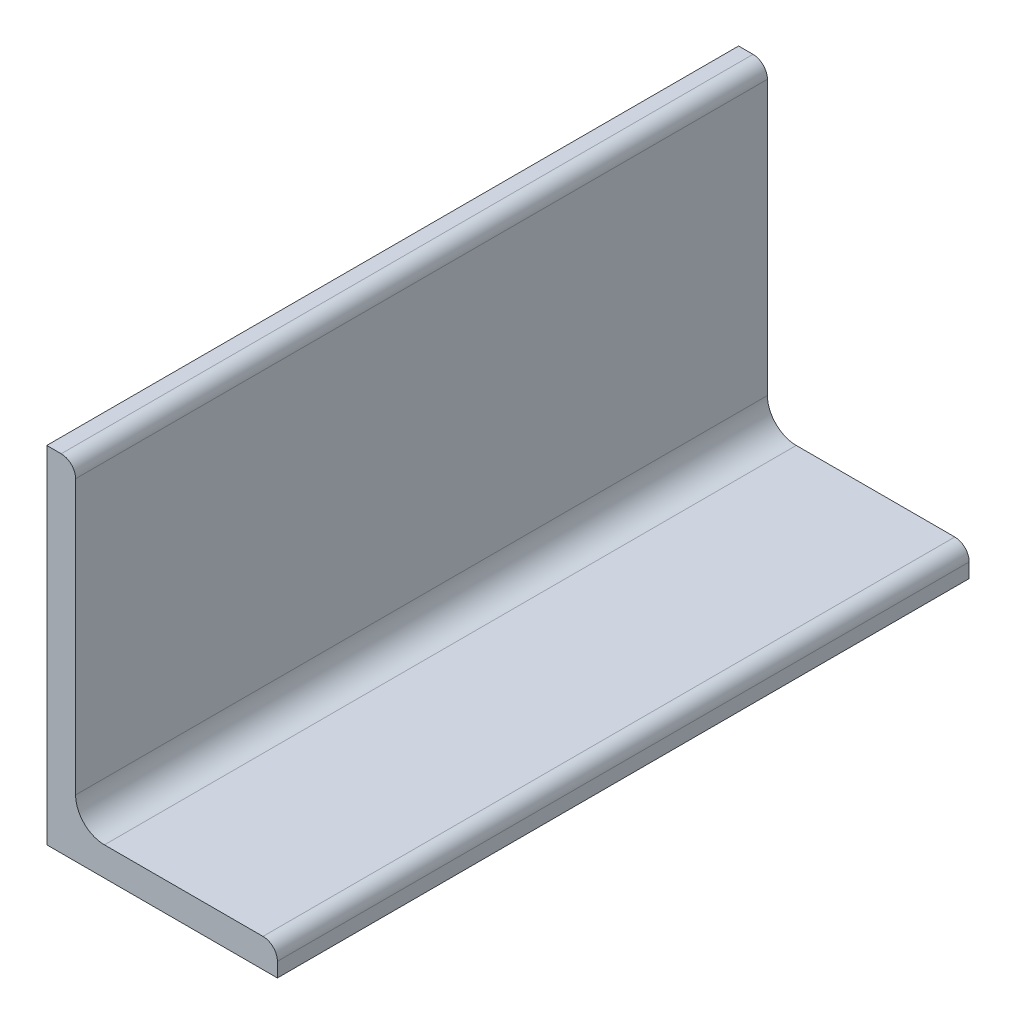
ISO-10303-21;
HEADER;
FILE_DESCRIPTION(('STEP AP214'),'2;1');
FILE_NAME('part.step','',(''),(''),'','','');
FILE_SCHEMA(('AUTOMOTIVE_DESIGN { 1 0 10303 214 1 1 1 1 }'));
ENDSEC;
DATA;
#1=APPLICATION_CONTEXT('core data for automotive mechanical design processes');
#2=APPLICATION_PROTOCOL_DEFINITION('international standard','automotive_design',2000,#1);
#3=PRODUCT_CONTEXT('',#1,'mechanical');
#4=PRODUCT('Part','Part','',(#3));
#5=PRODUCT_RELATED_PRODUCT_CATEGORY('part','',(#4));
#6=PRODUCT_DEFINITION_FORMATION('','',#4);
#7=PRODUCT_DEFINITION_CONTEXT('part definition',#1,'design');
#8=PRODUCT_DEFINITION('design','',#6,#7);
#9=PRODUCT_DEFINITION_SHAPE('','',#8);
#10=(LENGTH_UNIT() NAMED_UNIT(*) SI_UNIT(.MILLI.,.METRE.));
#11=(NAMED_UNIT(*) PLANE_ANGLE_UNIT() SI_UNIT($,.RADIAN.));
#12=(NAMED_UNIT(*) SI_UNIT($,.STERADIAN.) SOLID_ANGLE_UNIT());
#13=UNCERTAINTY_MEASURE_WITH_UNIT(LENGTH_MEASURE(1.E-05),#10,'distance_accuracy_value','');
#14=(GEOMETRIC_REPRESENTATION_CONTEXT(3) GLOBAL_UNCERTAINTY_ASSIGNED_CONTEXT((#13)) GLOBAL_UNIT_ASSIGNED_CONTEXT((#10,
#11,#12)) REPRESENTATION_CONTEXT('',''));
#15=CARTESIAN_POINT('',(0.,0.,0.));
#16=DIRECTION('',(0.,0.,1.));
#17=DIRECTION('',(1.,0.,0.));
#18=AXIS2_PLACEMENT_3D('',#15,#16,#17);
#19=CARTESIAN_POINT('',(0.865045893659089,152.925428131371,304.8));
#20=DIRECTION('',(1.,0.,0.));
#21=DIRECTION('',(0.,0.,-1.));
#22=AXIS2_PLACEMENT_3D('',#19,#20,#21);
#23=PLANE('',#22);
#24=DIRECTION('',(0.,-1.,0.));
#25=VECTOR('',#24,1.);
#26=CARTESIAN_POINT('',(0.865045893659089,152.925428131371,0.));
#27=LINE('',#26,#25);
#28=CARTESIAN_POINT('',(0.865045893659089,152.925428131371,0.));
#29=VERTEX_POINT('',#28);
#30=CARTESIAN_POINT('',(0.865045893659089,0.525428131371291,0.));
#31=VERTEX_POINT('',#30);
#32=EDGE_CURVE('E135',#29,#31,#27,.T.);
#33=ORIENTED_EDGE('',*,*,#32,.T.);
#34=DIRECTION('',(0.,0.,-1.));
#35=VECTOR('',#34,1.);
#36=CARTESIAN_POINT('',(0.865045893659089,0.525428131371291,304.8));
#37=LINE('',#36,#35);
#38=CARTESIAN_POINT('',(0.865045893659089,0.525428131371291,304.8));
#39=VERTEX_POINT('',#38);
#40=EDGE_CURVE('E11',#39,#31,#37,.T.);
#41=ORIENTED_EDGE('',*,*,#40,.F.);
#42=DIRECTION('',(0.,-1.,0.));
#43=VECTOR('',#42,1.);
#44=CARTESIAN_POINT('',(0.865045893659089,152.925428131371,304.8));
#45=LINE('',#44,#43);
#46=CARTESIAN_POINT('',(0.865045893659089,152.925428131371,304.8));
#47=VERTEX_POINT('',#46);
#48=EDGE_CURVE('E151',#47,#39,#45,.T.);
#49=ORIENTED_EDGE('',*,*,#48,.F.);
#50=DIRECTION('',(0.,0.,-1.));
#51=VECTOR('',#50,1.);
#52=CARTESIAN_POINT('',(0.865045893659089,152.925428131371,304.8));
#53=LINE('',#52,#51);
#54=EDGE_CURVE('E131',#47,#29,#53,.T.);
#55=ORIENTED_EDGE('',*,*,#54,.T.);
#56=EDGE_LOOP('',(#33,#41,#49,#55));
#57=FACE_BOUND('',#56,.T.);
#58=ADVANCED_FACE('F33',(#57),#23,.F.);
#59=CARTESIAN_POINT('',(0.865045893659089,0.525428131371291,304.8));
#60=DIRECTION('',(0.,1.,0.));
#61=DIRECTION('',(0.,0.,1.));
#62=AXIS2_PLACEMENT_3D('',#59,#60,#61);
#63=PLANE('',#62);
#64=DIRECTION('',(1.,0.,0.));
#65=VECTOR('',#64,1.);
#66=CARTESIAN_POINT('',(0.865045893659089,0.525428131371291,0.));
#67=LINE('',#66,#65);
#68=CARTESIAN_POINT('',(102.465045893659,0.525428131371291,0.));
#69=VERTEX_POINT('',#68);
#70=EDGE_CURVE('E138',#31,#69,#67,.T.);
#71=ORIENTED_EDGE('',*,*,#70,.T.);
#72=DIRECTION('',(0.,0.,-1.));
#73=VECTOR('',#72,1.);
#74=CARTESIAN_POINT('',(102.465045893659,0.525428131371291,304.8));
#75=LINE('',#74,#73);
#76=CARTESIAN_POINT('',(102.465045893659,0.525428131371291,304.8));
#77=VERTEX_POINT('',#76);
#78=EDGE_CURVE('E41',#77,#69,#75,.T.);
#79=ORIENTED_EDGE('',*,*,#78,.F.);
#80=DIRECTION('',(1.,0.,0.));
#81=VECTOR('',#80,1.);
#82=CARTESIAN_POINT('',(0.865045893659089,0.525428131371291,304.8));
#83=LINE('',#82,#81);
#84=EDGE_CURVE('E95',#39,#77,#83,.T.);
#85=ORIENTED_EDGE('',*,*,#84,.F.);
#86=ORIENTED_EDGE('',*,*,#40,.T.);
#87=EDGE_LOOP('',(#71,#79,#85,#86));
#88=FACE_BOUND('',#87,.T.);
#89=ADVANCED_FACE('F194',(#88),#63,.F.);
#90=CARTESIAN_POINT('',(102.465045893659,0.525428131371291,304.8));
#91=DIRECTION('',(-1.,0.,0.));
#92=DIRECTION('',(0.,0.,1.));
#93=AXIS2_PLACEMENT_3D('',#90,#91,#92);
#94=PLANE('',#93);
#95=DIRECTION('',(0.,1.,0.));
#96=VECTOR('',#95,1.);
#97=CARTESIAN_POINT('',(102.465045893659,0.525428131371291,0.));
#98=LINE('',#97,#96);
#99=CARTESIAN_POINT('',(102.465045893659,6.87542813137129,0.));
#100=VERTEX_POINT('',#99);
#101=EDGE_CURVE('E140',#69,#100,#98,.T.);
#102=ORIENTED_EDGE('',*,*,#101,.T.);
#103=DIRECTION('',(0.,0.,-1.));
#104=VECTOR('',#103,1.);
#105=CARTESIAN_POINT('',(102.465045893659,6.87542813137129,304.8));
#106=LINE('',#105,#104);
#107=CARTESIAN_POINT('',(102.465045893659,6.87542813137129,304.8));
#108=VERTEX_POINT('',#107);
#109=EDGE_CURVE('E161',#108,#100,#106,.T.);
#110=ORIENTED_EDGE('',*,*,#109,.F.);
#111=DIRECTION('',(0.,1.,0.));
#112=VECTOR('',#111,1.);
#113=CARTESIAN_POINT('',(102.465045893659,0.525428131371291,304.8));
#114=LINE('',#113,#112);
#115=EDGE_CURVE('E169',#77,#108,#114,.T.);
#116=ORIENTED_EDGE('',*,*,#115,.F.);
#117=ORIENTED_EDGE('',*,*,#78,.T.);
#118=EDGE_LOOP('',(#102,#110,#116,#117));
#119=FACE_BOUND('',#118,.T.);
#120=ADVANCED_FACE('F167',(#119),#94,.F.);
#121=CARTESIAN_POINT('',(96.1150458936591,6.87542813137129,304.8));
#122=DIRECTION('',(0.,0.,-1.));
#123=DIRECTION('',(-1.,0.,0.));
#124=AXIS2_PLACEMENT_3D('',#121,#122,#123);
#125=CYLINDRICAL_SURFACE('',#124,6.35);
#126=CARTESIAN_POINT('',(96.1150458936591,6.87542813137129,0.));
#127=DIRECTION('',(0.,0.,1.));
#128=DIRECTION('',(1.,0.,0.));
#129=AXIS2_PLACEMENT_3D('',#126,#127,#128);
#130=CIRCLE('',#129,6.35);
#131=CARTESIAN_POINT('',(96.1150458936591,13.2254281313713,0.));
#132=VERTEX_POINT('',#131);
#133=EDGE_CURVE('E142',#100,#132,#130,.T.);
#134=ORIENTED_EDGE('',*,*,#133,.T.);
#135=DIRECTION('',(0.,0.,-1.));
#136=VECTOR('',#135,1.);
#137=CARTESIAN_POINT('',(96.1150458936591,13.2254281313713,304.8));
#138=LINE('',#137,#136);
#139=CARTESIAN_POINT('',(96.1150458936591,13.2254281313713,304.8));
#140=VERTEX_POINT('',#139);
#141=EDGE_CURVE('E158',#140,#132,#138,.T.);
#142=ORIENTED_EDGE('',*,*,#141,.F.);
#143=CARTESIAN_POINT('',(96.1150458936591,6.87542813137129,304.8));
#144=DIRECTION('',(0.,0.,1.));
#145=DIRECTION('',(1.,0.,0.));
#146=AXIS2_PLACEMENT_3D('',#143,#144,#145);
#147=CIRCLE('',#146,6.35);
#148=EDGE_CURVE('E185',#108,#140,#147,.T.);
#149=ORIENTED_EDGE('',*,*,#148,.F.);
#150=ORIENTED_EDGE('',*,*,#109,.T.);
#151=EDGE_LOOP('',(#134,#142,#149,#150));
#152=FACE_BOUND('',#151,.T.);
#153=ADVANCED_FACE('F178',(#152),#125,.T.);
#154=CARTESIAN_POINT('',(96.1150458936591,13.2254281313713,304.8));
#155=DIRECTION('',(0.,-1.,0.));
#156=DIRECTION('',(0.,0.,-1.));
#157=AXIS2_PLACEMENT_3D('',#154,#155,#156);
#158=PLANE('',#157);
#159=DIRECTION('',(-1.,0.,0.));
#160=VECTOR('',#159,1.);
#161=CARTESIAN_POINT('',(96.1150458936591,13.2254281313713,0.));
#162=LINE('',#161,#160);
#163=CARTESIAN_POINT('',(26.2650458936591,13.2254281313713,0.));
#164=VERTEX_POINT('',#163);
#165=EDGE_CURVE('E144',#132,#164,#162,.T.);
#166=ORIENTED_EDGE('',*,*,#165,.T.);
#167=DIRECTION('',(0.,0.,-1.));
#168=VECTOR('',#167,1.);
#169=CARTESIAN_POINT('',(26.2650458936591,13.2254281313713,304.8));
#170=LINE('',#169,#168);
#171=CARTESIAN_POINT('',(26.2650458936591,13.2254281313713,304.8));
#172=VERTEX_POINT('',#171);
#173=EDGE_CURVE('E155',#172,#164,#170,.T.);
#174=ORIENTED_EDGE('',*,*,#173,.F.);
#175=DIRECTION('',(-1.,0.,0.));
#176=VECTOR('',#175,1.);
#177=CARTESIAN_POINT('',(96.1150458936591,13.2254281313713,304.8));
#178=LINE('',#177,#176);
#179=EDGE_CURVE('E184',#140,#172,#178,.T.);
#180=ORIENTED_EDGE('',*,*,#179,.F.);
#181=ORIENTED_EDGE('',*,*,#141,.T.);
#182=EDGE_LOOP('',(#166,#174,#180,#181));
#183=FACE_BOUND('',#182,.T.);
#184=ADVANCED_FACE('F182',(#183),#158,.F.);
#185=CARTESIAN_POINT('',(26.2650458936591,25.9254281313713,304.8));
#186=DIRECTION('',(0.,0.,-1.));
#187=DIRECTION('',(-1.,0.,0.));
#188=AXIS2_PLACEMENT_3D('',#185,#186,#187);
#189=CYLINDRICAL_SURFACE('',#188,12.7);
#190=CARTESIAN_POINT('',(26.2650458936591,25.9254281313713,0.));
#191=DIRECTION('',(0.,0.,-1.));
#192=DIRECTION('',(1.,0.,0.));
#193=AXIS2_PLACEMENT_3D('',#190,#191,#192);
#194=CIRCLE('',#193,12.7);
#195=CARTESIAN_POINT('',(13.5650458936591,25.9254281313713,0.));
#196=VERTEX_POINT('',#195);
#197=EDGE_CURVE('E146',#164,#196,#194,.T.);
#198=ORIENTED_EDGE('',*,*,#197,.T.);
#199=DIRECTION('',(0.,0.,-1.));
#200=VECTOR('',#199,1.);
#201=CARTESIAN_POINT('',(13.5650458936591,25.9254281313713,304.8));
#202=LINE('',#201,#200);
#203=CARTESIAN_POINT('',(13.5650458936591,25.9254281313713,304.8));
#204=VERTEX_POINT('',#203);
#205=EDGE_CURVE('E126',#204,#196,#202,.T.);
#206=ORIENTED_EDGE('',*,*,#205,.F.);
#207=CARTESIAN_POINT('',(26.2650458936591,25.9254281313713,304.8));
#208=DIRECTION('',(0.,0.,-1.));
#209=DIRECTION('',(1.,0.,0.));
#210=AXIS2_PLACEMENT_3D('',#207,#208,#209);
#211=CIRCLE('',#210,12.7);
#212=EDGE_CURVE('E117',#172,#204,#211,.T.);
#213=ORIENTED_EDGE('',*,*,#212,.F.);
#214=ORIENTED_EDGE('',*,*,#173,.T.);
#215=EDGE_LOOP('',(#198,#206,#213,#214));
#216=FACE_BOUND('',#215,.T.);
#217=ADVANCED_FACE('F206',(#216),#189,.F.);
#218=CARTESIAN_POINT('',(13.5650458936591,25.9254281313713,304.8));
#219=DIRECTION('',(-1.,0.,0.));
#220=DIRECTION('',(0.,0.,1.));
#221=AXIS2_PLACEMENT_3D('',#218,#219,#220);
#222=PLANE('',#221);
#223=DIRECTION('',(0.,1.,0.));
#224=VECTOR('',#223,1.);
#225=CARTESIAN_POINT('',(13.5650458936591,25.9254281313713,0.));
#226=LINE('',#225,#224);
#227=CARTESIAN_POINT('',(13.5650458936591,146.575428131371,0.));
#228=VERTEX_POINT('',#227);
#229=EDGE_CURVE('E125',#196,#228,#226,.T.);
#230=ORIENTED_EDGE('',*,*,#229,.T.);
#231=DIRECTION('',(0.,0.,-1.));
#232=VECTOR('',#231,1.);
#233=CARTESIAN_POINT('',(13.5650458936591,146.575428131371,304.8));
#234=LINE('',#233,#232);
#235=CARTESIAN_POINT('',(13.5650458936591,146.575428131371,304.8));
#236=VERTEX_POINT('',#235);
#237=EDGE_CURVE('E122',#236,#228,#234,.T.);
#238=ORIENTED_EDGE('',*,*,#237,.F.);
#239=DIRECTION('',(0.,1.,0.));
#240=VECTOR('',#239,1.);
#241=CARTESIAN_POINT('',(13.5650458936591,25.9254281313713,304.8));
#242=LINE('',#241,#240);
#243=EDGE_CURVE('E111',#204,#236,#242,.T.);
#244=ORIENTED_EDGE('',*,*,#243,.F.);
#245=ORIENTED_EDGE('',*,*,#205,.T.);
#246=EDGE_LOOP('',(#230,#238,#244,#245));
#247=FACE_BOUND('',#246,.T.);
#248=ADVANCED_FACE('F123',(#247),#222,.F.);
#249=CARTESIAN_POINT('',(7.21504589365909,146.575428131371,304.8));
#250=DIRECTION('',(0.,0.,-1.));
#251=DIRECTION('',(-1.,0.,0.));
#252=AXIS2_PLACEMENT_3D('',#249,#250,#251);
#253=CYLINDRICAL_SURFACE('',#252,6.35);
#254=CARTESIAN_POINT('',(7.21504589365909,146.575428131371,0.));
#255=DIRECTION('',(0.,0.,1.));
#256=DIRECTION('',(1.,0.,0.));
#257=AXIS2_PLACEMENT_3D('',#254,#255,#256);
#258=CIRCLE('',#257,6.35);
#259=CARTESIAN_POINT('',(7.21504589365909,152.925428131371,0.));
#260=VERTEX_POINT('',#259);
#261=EDGE_CURVE('E81',#228,#260,#258,.T.);
#262=ORIENTED_EDGE('',*,*,#261,.T.);
#263=DIRECTION('',(0.,0.,-1.));
#264=VECTOR('',#263,1.);
#265=CARTESIAN_POINT('',(7.21504589365909,152.925428131371,304.8));
#266=LINE('',#265,#264);
#267=CARTESIAN_POINT('',(7.21504589365909,152.925428131371,304.8));
#268=VERTEX_POINT('',#267);
#269=EDGE_CURVE('E127',#268,#260,#266,.T.);
#270=ORIENTED_EDGE('',*,*,#269,.F.);
#271=CARTESIAN_POINT('',(7.21504589365909,146.575428131371,304.8));
#272=DIRECTION('',(0.,0.,1.));
#273=DIRECTION('',(1.,0.,0.));
#274=AXIS2_PLACEMENT_3D('',#271,#272,#273);
#275=CIRCLE('',#274,6.35);
#276=EDGE_CURVE('E115',#236,#268,#275,.T.);
#277=ORIENTED_EDGE('',*,*,#276,.F.);
#278=ORIENTED_EDGE('',*,*,#237,.T.);
#279=EDGE_LOOP('',(#262,#270,#277,#278));
#280=FACE_BOUND('',#279,.T.);
#281=ADVANCED_FACE('F129',(#280),#253,.T.);
#282=CARTESIAN_POINT('',(7.21504589365909,152.925428131371,304.8));
#283=DIRECTION('',(0.,-1.,0.));
#284=DIRECTION('',(0.,0.,-1.));
#285=AXIS2_PLACEMENT_3D('',#282,#283,#284);
#286=PLANE('',#285);
#287=DIRECTION('',(-1.,0.,0.));
#288=VECTOR('',#287,1.);
#289=CARTESIAN_POINT('',(7.21504589365909,152.925428131371,0.));
#290=LINE('',#289,#288);
#291=EDGE_CURVE('E87',#260,#29,#290,.T.);
#292=ORIENTED_EDGE('',*,*,#291,.T.);
#293=ORIENTED_EDGE('',*,*,#54,.F.);
#294=DIRECTION('',(-1.,0.,0.));
#295=VECTOR('',#294,1.);
#296=CARTESIAN_POINT('',(7.21504589365909,152.925428131371,304.8));
#297=LINE('',#296,#295);
#298=EDGE_CURVE('E49',#268,#47,#297,.T.);
#299=ORIENTED_EDGE('',*,*,#298,.F.);
#300=ORIENTED_EDGE('',*,*,#269,.T.);
#301=EDGE_LOOP('',(#292,#293,#299,#300));
#302=FACE_BOUND('',#301,.T.);
#303=ADVANCED_FACE('F214',(#302),#286,.F.);
#304=CARTESIAN_POINT('',(96.1150458936591,6.87542813137129,304.8));
#305=DIRECTION('',(0.,0.,1.));
#306=DIRECTION('',(1.,0.,0.));
#307=AXIS2_PLACEMENT_3D('',#304,#305,#306);
#308=PLANE('',#307);
#309=ORIENTED_EDGE('',*,*,#48,.T.);
#310=ORIENTED_EDGE('',*,*,#84,.T.);
#311=ORIENTED_EDGE('',*,*,#115,.T.);
#312=ORIENTED_EDGE('',*,*,#148,.T.);
#313=ORIENTED_EDGE('',*,*,#179,.T.);
#314=ORIENTED_EDGE('',*,*,#212,.T.);
#315=ORIENTED_EDGE('',*,*,#243,.T.);
#316=ORIENTED_EDGE('',*,*,#276,.T.);
#317=ORIENTED_EDGE('',*,*,#298,.T.);
#318=EDGE_LOOP('',(#309,#310,#311,#312,#313,#314,#315,#316,#317));
#319=FACE_BOUND('',#318,.T.);
#320=ADVANCED_FACE('F113',(#319),#308,.T.);
#321=CARTESIAN_POINT('',(96.1150458936591,6.87542813137129,0.));
#322=DIRECTION('',(0.,0.,1.));
#323=DIRECTION('',(1.,0.,0.));
#324=AXIS2_PLACEMENT_3D('',#321,#322,#323);
#325=PLANE('',#324);
#326=ORIENTED_EDGE('',*,*,#32,.F.);
#327=ORIENTED_EDGE('',*,*,#291,.F.);
#328=ORIENTED_EDGE('',*,*,#261,.F.);
#329=ORIENTED_EDGE('',*,*,#229,.F.);
#330=ORIENTED_EDGE('',*,*,#197,.F.);
#331=ORIENTED_EDGE('',*,*,#165,.F.);
#332=ORIENTED_EDGE('',*,*,#133,.F.);
#333=ORIENTED_EDGE('',*,*,#101,.F.);
#334=ORIENTED_EDGE('',*,*,#70,.F.);
#335=EDGE_LOOP('',(#326,#327,#328,#329,#330,#331,#332,#333,#334));
#336=FACE_BOUND('',#335,.T.);
#337=ADVANCED_FACE('F173',(#336),#325,.F.);
#338=CLOSED_SHELL('',(#58,#89,#120,#153,#184,#217,#248,#281,#303,#320,#337));
#339=MANIFOLD_SOLID_BREP('B2',#338);
#340=ADVANCED_BREP_SHAPE_REPRESENTATION('',(#18,#339),#14);
#341=SHAPE_DEFINITION_REPRESENTATION(#9,#340);
ENDSEC;
END-ISO-10303-21;
